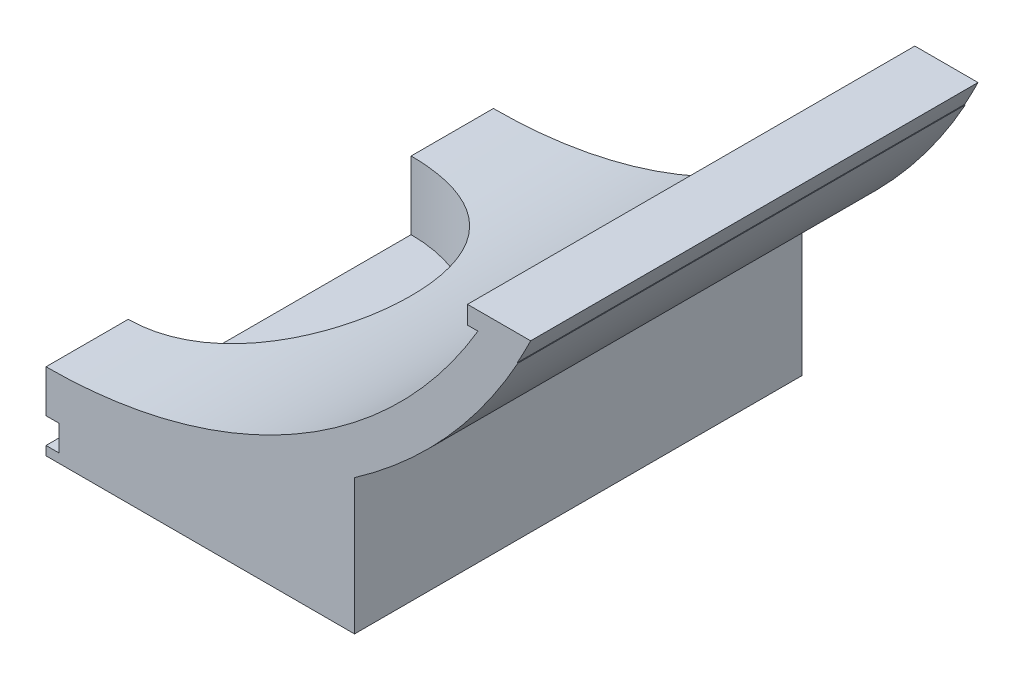
ISO-10303-21;
HEADER;
FILE_DESCRIPTION(('STEP AP214'),'2;1');
FILE_NAME('part.step','',(''),(''),'','','');
FILE_SCHEMA(('AUTOMOTIVE_DESIGN { 1 0 10303 214 1 1 1 1 }'));
ENDSEC;
DATA;
#1=APPLICATION_CONTEXT('core data for automotive mechanical design processes');
#2=APPLICATION_PROTOCOL_DEFINITION('international standard','automotive_design',2000,#1);
#3=PRODUCT_CONTEXT('',#1,'mechanical');
#4=PRODUCT('Part','Part','',(#3));
#5=PRODUCT_RELATED_PRODUCT_CATEGORY('part','',(#4));
#6=PRODUCT_DEFINITION_FORMATION('','',#4);
#7=PRODUCT_DEFINITION_CONTEXT('part definition',#1,'design');
#8=PRODUCT_DEFINITION('design','',#6,#7);
#9=PRODUCT_DEFINITION_SHAPE('','',#8);
#10=(LENGTH_UNIT() NAMED_UNIT(*) SI_UNIT(.MILLI.,.METRE.));
#11=(NAMED_UNIT(*) PLANE_ANGLE_UNIT() SI_UNIT($,.RADIAN.));
#12=(NAMED_UNIT(*) SI_UNIT($,.STERADIAN.) SOLID_ANGLE_UNIT());
#13=UNCERTAINTY_MEASURE_WITH_UNIT(LENGTH_MEASURE(1.E-05),#10,'distance_accuracy_value','');
#14=(GEOMETRIC_REPRESENTATION_CONTEXT(3) GLOBAL_UNCERTAINTY_ASSIGNED_CONTEXT((#13)) GLOBAL_UNIT_ASSIGNED_CONTEXT((#10,
#11,#12)) REPRESENTATION_CONTEXT('',''));
#15=CARTESIAN_POINT('',(0.,0.,0.));
#16=DIRECTION('',(0.,0.,1.));
#17=DIRECTION('',(1.,0.,0.));
#18=AXIS2_PLACEMENT_3D('',#15,#16,#17);
#19=CARTESIAN_POINT('',(0.,0.,174.));
#20=DIRECTION('',(0.,0.,1.));
#21=DIRECTION('',(1.,0.,0.));
#22=AXIS2_PLACEMENT_3D('',#19,#20,#21);
#23=PLANE('',#22);
#24=DIRECTION('',(0.,1.,0.));
#25=VECTOR('',#24,1.);
#26=CARTESIAN_POINT('',(0.,0.,174.));
#27=LINE('',#26,#25);
#28=CARTESIAN_POINT('',(0.,-225.,174.));
#29=VERTEX_POINT('',#28);
#30=CARTESIAN_POINT('',(0.,-221.5,174.));
#31=VERTEX_POINT('',#30);
#32=EDGE_CURVE('E58',#29,#31,#27,.T.);
#33=ORIENTED_EDGE('',*,*,#32,.F.);
#34=DIRECTION('',(1.,0.,0.));
#35=VECTOR('',#34,1.);
#36=CARTESIAN_POINT('',(0.,-225.,174.));
#37=LINE('',#36,#35);
#38=CARTESIAN_POINT('',(120.,-225.,174.));
#39=VERTEX_POINT('',#38);
#40=EDGE_CURVE('E185',#29,#39,#37,.T.);
#41=ORIENTED_EDGE('',*,*,#40,.T.);
#42=DIRECTION('',(0.,1.,0.));
#43=VECTOR('',#42,1.);
#44=CARTESIAN_POINT('',(120.,0.,174.));
#45=LINE('',#44,#43);
#46=CARTESIAN_POINT('',(120.,-172.336879396141,174.));
#47=VERTEX_POINT('',#46);
#48=EDGE_CURVE('E223',#39,#47,#45,.T.);
#49=ORIENTED_EDGE('',*,*,#48,.T.);
#50=CARTESIAN_POINT('',(0.,0.,174.));
#51=DIRECTION('',(0.,0.,1.));
#52=DIRECTION('',(1.,0.,0.));
#53=AXIS2_PLACEMENT_3D('',#50,#51,#52);
#54=CIRCLE('',#53,210.);
#55=CARTESIAN_POINT('',(183.56470248934,-102.,174.));
#56=VERTEX_POINT('',#55);
#57=EDGE_CURVE('E241',#47,#56,#54,.T.);
#58=ORIENTED_EDGE('',*,*,#57,.T.);
#59=DIRECTION('',(1.,0.,0.));
#60=VECTOR('',#59,1.);
#61=CARTESIAN_POINT('',(0.,-102.,174.));
#62=LINE('',#61,#60);
#63=CARTESIAN_POINT('',(183.278647146906,-102.,174.));
#64=VERTEX_POINT('',#63);
#65=EDGE_CURVE('E236',#64,#56,#62,.T.);
#66=ORIENTED_EDGE('',*,*,#65,.F.);
#67=CARTESIAN_POINT('',(0.,0.,174.));
#68=DIRECTION('',(0.,0.,1.));
#69=DIRECTION('',(1.,0.,0.));
#70=AXIS2_PLACEMENT_3D('',#67,#68,#69);
#71=CIRCLE('',#70,209.75);
#72=CARTESIAN_POINT('',(188.496850106308,-92.0000000000001,174.));
#73=VERTEX_POINT('',#72);
#74=EDGE_CURVE('E209',#64,#73,#71,.T.);
#75=ORIENTED_EDGE('',*,*,#74,.T.);
#76=DIRECTION('',(-1.,0.,0.));
#77=VECTOR('',#76,1.);
#78=CARTESIAN_POINT('',(171.933126534708,-92.,174.));
#79=LINE('',#78,#77);
#80=CARTESIAN_POINT('',(163.933126534708,-92.,174.));
#81=VERTEX_POINT('',#80);
#82=EDGE_CURVE('E217',#73,#81,#79,.T.);
#83=ORIENTED_EDGE('',*,*,#82,.T.);
#84=DIRECTION('',(0.,1.,0.));
#85=VECTOR('',#84,1.);
#86=CARTESIAN_POINT('',(163.933126534708,-92.,174.));
#87=LINE('',#86,#85);
#88=CARTESIAN_POINT('',(163.933126534708,-99.,174.));
#89=VERTEX_POINT('',#88);
#90=EDGE_CURVE('E199',#89,#81,#87,.T.);
#91=ORIENTED_EDGE('',*,*,#90,.F.);
#92=DIRECTION('',(-1.,0.,0.));
#93=VECTOR('',#92,1.);
#94=CARTESIAN_POINT('',(163.933126534708,-99.,174.));
#95=LINE('',#94,#93);
#96=CARTESIAN_POINT('',(168.,-99.,174.));
#97=VERTEX_POINT('',#96);
#98=EDGE_CURVE('E193',#97,#89,#95,.T.);
#99=ORIENTED_EDGE('',*,*,#98,.F.);
#100=CARTESIAN_POINT('',(0.,0.,174.));
#101=DIRECTION('',(0.,0.,-1.));
#102=DIRECTION('',(1.,0.,0.));
#103=AXIS2_PLACEMENT_3D('',#100,#101,#102);
#104=CIRCLE('',#103,195.);
#105=CARTESIAN_POINT('',(0.,-195.,174.));
#106=VERTEX_POINT('',#105);
#107=EDGE_CURVE('E159',#97,#106,#104,.T.);
#108=ORIENTED_EDGE('',*,*,#107,.T.);
#109=CARTESIAN_POINT('',(0.,-211.5,174.));
#110=VERTEX_POINT('',#109);
#111=EDGE_CURVE('E148',#110,#106,#27,.T.);
#112=ORIENTED_EDGE('',*,*,#111,.F.);
#113=DIRECTION('',(1.,0.,0.));
#114=VECTOR('',#113,1.);
#115=CARTESIAN_POINT('',(0.,-211.5,174.));
#116=LINE('',#115,#114);
#117=CARTESIAN_POINT('',(5.,-211.5,174.));
#118=VERTEX_POINT('',#117);
#119=EDGE_CURVE('E156',#110,#118,#116,.T.);
#120=ORIENTED_EDGE('',*,*,#119,.T.);
#121=DIRECTION('',(0.,-1.,0.));
#122=VECTOR('',#121,1.);
#123=CARTESIAN_POINT('',(5.00000000000002,0.,174.));
#124=LINE('',#123,#122);
#125=CARTESIAN_POINT('',(5.,-221.5,174.));
#126=VERTEX_POINT('',#125);
#127=EDGE_CURVE('E167',#118,#126,#124,.T.);
#128=ORIENTED_EDGE('',*,*,#127,.T.);
#129=DIRECTION('',(-1.,0.,0.));
#130=VECTOR('',#129,1.);
#131=CARTESIAN_POINT('',(0.,-221.5,174.));
#132=LINE('',#131,#130);
#133=EDGE_CURVE('E171',#126,#31,#132,.T.);
#134=ORIENTED_EDGE('',*,*,#133,.T.);
#135=EDGE_LOOP('',(#33,#41,#49,#58,#66,#75,#83,#91,#99,#108,#112,#120,#128,#134));
#136=FACE_BOUND('',#135,.T.);
#137=ADVANCED_FACE('F43',(#136),#23,.T.);
#138=CARTESIAN_POINT('',(0.,-221.5,87.));
#139=DIRECTION('',(0.,1.,0.));
#140=DIRECTION('',(0.,0.,1.));
#141=AXIS2_PLACEMENT_3D('',#138,#139,#140);
#142=CYLINDRICAL_SURFACE('',#141,55.);
#143=CARTESIAN_POINT('',(0.,-195.,142.));
#144=CARTESIAN_POINT('',(1.51277598464168,-194.999997304751,141.999995610297));
#145=CARTESIAN_POINT('',(3.02563306617673,-194.982353560653,141.93753465475));
#146=CARTESIAN_POINT('',(6.04030681610823,-194.912258782389,141.688232088754));
#147=CARTESIAN_POINT('',(7.54212268342941,-194.859805247374,141.501381541749));
#148=CARTESIAN_POINT('',(10.5242864998696,-194.721514711655,141.004861870919));
#149=CARTESIAN_POINT('',(12.0046267379808,-194.635666013523,140.69514971122));
#150=CARTESIAN_POINT('',(14.9327576670529,-194.432936319551,139.955576125098));
#151=CARTESIAN_POINT('',(16.3805488217454,-194.316055766129,139.525716411608));
#152=CARTESIAN_POINT('',(19.2316449690921,-194.054606947669,138.550081244053));
#153=CARTESIAN_POINT('',(20.6350093429244,-193.910077631711,138.004468735609));
#154=CARTESIAN_POINT('',(23.3900720949104,-193.597073533787,136.80124640194));
#155=CARTESIAN_POINT('',(24.7417703476622,-193.428598693706,136.143636304901));
#156=CARTESIAN_POINT('',(27.3849321959632,-193.072121722803,134.72125352611));
#157=CARTESIAN_POINT('',(28.6763923140339,-192.884118466645,133.956474667808));
#158=CARTESIAN_POINT('',(31.1910004963923,-192.493482436804,132.32513389038));
#159=CARTESIAN_POINT('',(32.4141473302252,-192.290849399763,131.458570138783));
#160=CARTESIAN_POINT('',(34.8121052649309,-191.871397239887,129.608255675445));
#161=CARTESIAN_POINT('',(35.985145512741,-191.654358471269,128.62225916456));
#162=CARTESIAN_POINT('',(38.2445264347831,-191.21631917666,126.556283582681));
#163=CARTESIAN_POINT('',(39.3308658605527,-190.995318593676,125.47630315882));
#164=CARTESIAN_POINT('',(41.4100573863605,-190.555337694959,123.229140506784));
#165=CARTESIAN_POINT('',(42.4028965244983,-190.336357663118,122.061946228299));
#166=CARTESIAN_POINT('',(44.2884084378103,-189.906482695444,119.647858408345));
#167=CARTESIAN_POINT('',(45.181080405655,-189.695587824785,118.400964224635));
#168=CARTESIAN_POINT('',(46.8765745407372,-189.283815921787,115.810239545886));
#169=CARTESIAN_POINT('',(47.6772977159791,-189.083215525293,114.464990030597));
#170=CARTESIAN_POINT('',(49.162230637943,-188.702577945346,111.708813244506));
#171=CARTESIAN_POINT('',(49.8464384655657,-188.522541100608,110.297884892409));
#172=CARTESIAN_POINT('',(51.0927350973465,-188.188599218257,107.42034060372));
#173=CARTESIAN_POINT('',(51.6548437850889,-188.034689926722,105.953733780017));
#174=CARTESIAN_POINT('',(52.6522576710364,-187.757844041035,102.97517381577));
#175=CARTESIAN_POINT('',(53.0875668143327,-187.634906483282,101.46322208765));
#176=CARTESIAN_POINT('',(53.8181863976163,-187.426635157743,98.4435623179981));
#177=CARTESIAN_POINT('',(54.1167289707947,-187.340437004747,96.936695711525));
#178=CARTESIAN_POINT('',(54.586856670881,-187.203993562236,93.9016672922743));
#179=CARTESIAN_POINT('',(54.75844373239,-187.153747724864,92.3735058043586));
#180=CARTESIAN_POINT('',(54.9730432374301,-187.090825739297,89.3076899008145));
#181=CARTESIAN_POINT('',(55.0160792915418,-187.078142692059,87.7700372803878));
#182=CARTESIAN_POINT('',(54.9732343190708,-187.09073748328,84.6967010099465));
#183=CARTESIAN_POINT('',(54.887355681379,-187.116014618306,83.1610173239737));
#184=CARTESIAN_POINT('',(54.5922403009783,-187.202323309921,80.1515882440086));
#185=CARTESIAN_POINT('',(54.3869816817835,-187.262201453032,78.6774175080696));
#186=CARTESIAN_POINT('',(53.8581194766046,-187.41499037387,75.7522458772274));
#187=CARTESIAN_POINT('',(53.5345187495676,-187.507900353601,74.3012444234769));
#188=CARTESIAN_POINT('',(52.7716565927596,-187.724024039912,71.4322191048295));
#189=CARTESIAN_POINT('',(52.3323881639886,-187.847239580238,70.0141972411653));
#190=CARTESIAN_POINT('',(51.3416985166608,-188.120423591712,67.2205508089576));
#191=CARTESIAN_POINT('',(50.7902750928457,-188.270392588895,65.8449270746838));
#192=CARTESIAN_POINT('',(49.5719407427942,-188.594869390542,63.1281257936024));
#193=CARTESIAN_POINT('',(48.9036859021021,-188.769657733188,61.7875846456117));
#194=CARTESIAN_POINT('',(47.4613520849324,-189.137446531583,59.1673453312611));
#195=CARTESIAN_POINT('',(46.6872726568405,-189.330447065053,57.8876474245857));
#196=CARTESIAN_POINT('',(45.0384344896766,-189.729435603099,55.3966655699284));
#197=CARTESIAN_POINT('',(44.1636575337009,-189.935425954569,54.1853940600432));
#198=CARTESIAN_POINT('',(42.3192039321344,-190.354877199058,51.838767050779));
#199=CARTESIAN_POINT('',(41.3495249884407,-190.568338272905,50.7034133909127));
#200=CARTESIAN_POINT('',(39.2840355631165,-191.005023396751,48.475253402716));
#201=CARTESIAN_POINT('',(38.1849013302693,-191.228318156092,47.3855395329822));
#202=CARTESIAN_POINT('',(35.8982517288536,-191.67073699137,45.3021832093801));
#203=CARTESIAN_POINT('',(34.7107341671541,-191.889860963646,44.3085431408805));
#204=CARTESIAN_POINT('',(32.2549075063342,-192.317899025981,42.4240354736116));
#205=CARTESIAN_POINT('',(30.9865936554316,-192.526812514263,41.5331739281184));
#206=CARTESIAN_POINT('',(28.3774891485624,-192.928639740406,39.8606401400473));
#207=CARTESIAN_POINT('',(27.0366989896612,-193.121553587973,39.0789671487516));
#208=CARTESIAN_POINT('',(24.2841503406643,-193.486995820346,37.626785886393));
#209=CARTESIAN_POINT('',(22.872049070732,-193.659409035535,36.9568978383738));
#210=CARTESIAN_POINT('',(19.9933641479954,-193.977736178376,35.7388260939951));
#211=CARTESIAN_POINT('',(18.5267800671251,-194.123649897772,35.1906433540984));
#212=CARTESIAN_POINT('',(15.5499999242052,-194.384745205353,34.2207670888056));
#213=CARTESIAN_POINT('',(14.0398126256082,-194.499932921909,33.7990483377956));
#214=CARTESIAN_POINT('',(10.9868456927494,-194.696246881347,33.0857502506882));
#215=CARTESIAN_POINT('',(9.44406710114175,-194.777374212154,32.7941667579131));
#216=CARTESIAN_POINT('',(6.38759737955367,-194.901161078377,32.3510633816287));
#217=CARTESIAN_POINT('',(4.87455911709058,-194.94497035096,32.1953533234206));
#218=CARTESIAN_POINT('',(1.84018665814559,-194.997220478891,32.0097825472414));
#219=CARTESIAN_POINT('',(0.318852639704865,-195.005662090324,31.9799191389463));
#220=CARTESIAN_POINT('',(-2.72067114375175,-194.986942029158,32.0463054967055));
#221=CARTESIAN_POINT('',(-4.23886122557451,-194.959784138108,32.1425418678469));
#222=CARTESIAN_POINT('',(-7.26103653739713,-194.870630723845,32.4602353545998));
#223=CARTESIAN_POINT('',(-8.765021849285,-194.808635401589,32.6816917478914));
#224=CARTESIAN_POINT('',(-11.7185674550566,-194.653074412565,33.2423005147627));
#225=CARTESIAN_POINT('',(-13.1686167043497,-194.560151370275,33.5790608624129));
#226=CARTESIAN_POINT('',(-16.0346101227006,-194.344941863136,34.3682562724752));
#227=CARTESIAN_POINT('',(-17.4505548668401,-194.222655893797,34.8206893828778));
#228=CARTESIAN_POINT('',(-20.239101414165,-193.951905110252,35.837693591339));
#229=CARTESIAN_POINT('',(-21.6116996780089,-193.803438164791,36.4022738191746));
#230=CARTESIAN_POINT('',(-24.3046889918928,-193.484162013078,37.6393085686977));
#231=CARTESIAN_POINT('',(-25.6250788776387,-193.313352308927,38.3117654944437));
#232=CARTESIAN_POINT('',(-28.2329132181185,-192.949922490515,39.7751609714886));
#233=CARTESIAN_POINT('',(-29.519061548626,-192.756916069748,40.5683133943173));
#234=CARTESIAN_POINT('',(-32.0203400821098,-192.35722551291,42.2565691287422));
#235=CARTESIAN_POINT('',(-33.235469482682,-192.150541222357,43.1516735919021));
#236=CARTESIAN_POINT('',(-35.5874725145358,-191.728870384718,45.0380551409026));
#237=CARTESIAN_POINT('',(-36.7243310563164,-191.513882249171,46.0293506827473));
#238=CARTESIAN_POINT('',(-38.9125867826961,-191.081278017958,48.1016524547747));
#239=CARTESIAN_POINT('',(-39.9639823382036,-190.863661872288,49.1826603942576));
#240=CARTESIAN_POINT('',(-42.0068287968446,-190.424663688709,51.4634820536823));
#241=CARTESIAN_POINT('',(-42.9953032651288,-190.203382512631,52.6659833901291));
#242=CARTESIAN_POINT('',(-44.8675674807035,-189.770453355497,55.151572228421));
#243=CARTESIAN_POINT('',(-45.7513547796848,-189.558805599808,56.4346616138977));
#244=CARTESIAN_POINT('',(-47.4079032742508,-189.151311295467,59.0730086424281));
#245=CARTESIAN_POINT('',(-48.1806657935975,-188.95546455843,60.4282654247568));
#246=CARTESIAN_POINT('',(-49.609306663953,-188.585422348909,63.2018895610344));
#247=CARTESIAN_POINT('',(-50.2651868880261,-188.41122652948,64.6202559031836));
#248=CARTESIAN_POINT('',(-51.4515194101969,-188.090714591469,67.5024025647285));
#249=CARTESIAN_POINT('',(-51.9826387878447,-187.944251048306,68.9658917148034));
#250=CARTESIAN_POINT('',(-52.9195244587185,-187.682606546131,71.935223920435));
#251=CARTESIAN_POINT('',(-53.32529079328,-187.567425576802,73.4410669620252));
#252=CARTESIAN_POINT('',(-54.0077324467009,-187.372065704206,76.4835904167211));
#253=CARTESIAN_POINT('',(-54.2844395155644,-187.291878192473,78.0202631482542));
#254=CARTESIAN_POINT('',(-54.706299470099,-187.169092825265,81.113035288433));
#255=CARTESIAN_POINT('',(-54.8514566322037,-187.126493747863,82.6691340639081));
#256=CARTESIAN_POINT('',(-55.0059350885892,-187.081140474726,85.7311540434134));
#257=CARTESIAN_POINT('',(-55.0200592029773,-187.07697748964,87.2368141228749));
#258=CARTESIAN_POINT('',(-54.9248583842064,-187.104950316674,90.2438606326164));
#259=CARTESIAN_POINT('',(-54.8155366395511,-187.137085191252,91.7452471722744));
#260=CARTESIAN_POINT('',(-54.474438998226,-187.236660182412,94.7327825235859));
#261=CARTESIAN_POINT('',(-54.242667739981,-187.304098961669,96.2189319102538));
#262=CARTESIAN_POINT('',(-53.6587131692459,-187.472223660234,99.1654548680127));
#263=CARTESIAN_POINT('',(-53.306529257297,-187.572909745057,100.625828310743));
#264=CARTESIAN_POINT('',(-52.4887374259627,-187.803383553097,103.496617769752));
#265=CARTESIAN_POINT('',(-52.0242661681516,-187.932878661644,104.907381560932));
#266=CARTESIAN_POINT('',(-50.9838485852516,-188.217793669274,107.684434863653));
#267=CARTESIAN_POINT('',(-50.4079034401043,-188.373213293946,109.050724845765));
#268=CARTESIAN_POINT('',(-49.1487429468255,-188.705656652546,111.730405540767));
#269=CARTESIAN_POINT('',(-48.4655133229456,-188.882683260896,113.043789184439));
#270=CARTESIAN_POINT('',(-46.9966216973714,-189.253510163334,115.609488643802));
#271=CARTESIAN_POINT('',(-46.2109569467775,-189.447310907518,116.861802819423));
#272=CARTESIAN_POINT('',(-44.5151536149936,-189.853062976584,119.337676095336));
#273=CARTESIAN_POINT('',(-43.6017904708369,-190.065400173821,120.558964323428));
#274=CARTESIAN_POINT('',(-41.6774853507142,-190.496612007318,122.920853720066));
#275=CARTESIAN_POINT('',(-40.66654134687,-190.715486779373,124.061453210924));
#276=CARTESIAN_POINT('',(-38.5533331692757,-191.153877639405,126.255068471827));
#277=CARTESIAN_POINT('',(-37.4510474753336,-191.373393866689,127.308063484396));
#278=CARTESIAN_POINT('',(-35.1622995871373,-191.807114286307,129.319424849606));
#279=CARTESIAN_POINT('',(-33.975836966903,-192.021318451751,130.277790723315));
#280=CARTESIAN_POINT('',(-31.4957016907239,-192.443866652879,132.116095107206));
#281=CARTESIAN_POINT('',(-30.2000984393956,-192.651933098431,132.993495252527));
#282=CARTESIAN_POINT('',(-27.5368111149729,-193.05060678832,134.63582320654));
#283=CARTESIAN_POINT('',(-26.169123975991,-193.241213289103,135.400746226079));
#284=CARTESIAN_POINT('',(-23.3717389221184,-193.599455338112,136.811793217101));
#285=CARTESIAN_POINT('',(-21.9420720610811,-193.76710221867,137.457975850282));
#286=CARTESIAN_POINT('',(-19.0302533374737,-194.074706450383,138.626638816058));
#287=CARTESIAN_POINT('',(-17.5481076720372,-194.21466705819,139.149133699094));
#288=CARTESIAN_POINT('',(-14.7498370514193,-194.445706299648,140.002612249688));
#289=CARTESIAN_POINT('',(-13.4390480304431,-194.540866112287,140.350078116561));
#290=CARTESIAN_POINT('',(-10.793930863323,-194.705537511506,140.947464884264));
#291=CARTESIAN_POINT('',(-9.45960527280495,-194.775051864951,141.197396308171));
#292=CARTESIAN_POINT('',(-6.77514063970241,-194.88689524458,141.597975951774));
#293=CARTESIAN_POINT('',(-5.42500326360649,-194.929227109878,141.748634540207));
#294=CARTESIAN_POINT('',(-2.71659953508749,-194.985781967651,141.949653066806));
#295=CARTESIAN_POINT('',(-1.35833245921605,-195.000002420084,142.000003941546));
#296=CARTESIAN_POINT('',(0.,-195.,142.));
#297=B_SPLINE_CURVE_WITH_KNOTS('',3,(#143,#144,#145,#146,#147,#148,#149,#150,#151,#152,#153,
#154,#155,#156,#157,#158,#159,#160,#161,#162,#163,#164,#165,#166,#167,#168,#169,#170,#171,#172,
#173,#174,#175,#176,#177,#178,#179,#180,#181,#182,#183,#184,#185,#186,#187,#188,#189,#190,#191,
#192,#193,#194,#195,#196,#197,#198,#199,#200,#201,#202,#203,#204,#205,#206,#207,#208,#209,#210,
#211,#212,#213,#214,#215,#216,#217,#218,#219,#220,#221,#222,#223,#224,#225,#226,#227,#228,#229,
#230,#231,#232,#233,#234,#235,#236,#237,#238,#239,#240,#241,#242,#243,#244,#245,#246,#247,#248,
#249,#250,#251,#252,#253,#254,#255,#256,#257,#258,#259,#260,#261,#262,#263,#264,#265,#266,#267,
#268,#269,#270,#271,#272,#273,#274,#275,#276,#277,#278,#279,#280,#281,#282,#283,#284,#285,#286,
#287,#288,#289,#290,#291,#292,#293,#294,#295,#296),.UNSPECIFIED.,.T.,.F.,(4,2,2,2,2,2,2,2,2,2,2,
2,2,2,2,2,2,2,2,2,2,2,2,2,2,2,2,2,2,2,2,2,2,2,2,2,2,2,2,2,2,2,2,2,2,2,2,2,2,2,2,2,2,2,2,2,2,2,2,
2,2,2,2,2,2,2,2,2,2,2,2,2,2,2,2,2,4),(0.,4.53708199552157,9.07448998504358,13.6134887398362,
18.1524227858136,22.6850092589732,27.2176067327461,31.7504655451402,36.2834059768057,
40.9211271113907,45.5589150155437,50.197344910504,54.835812187691,59.5650078593128,
64.2942814169713,69.0227842441797,73.7511399386241,78.3611174003492,82.9710246118645,
87.5800850833786,92.1890601464245,96.6525972976513,101.116026624422,105.579726093363,
110.043513338709,114.562504972605,119.081515892236,123.601345621908,128.121284828783,
132.80716953111,137.493170547082,142.179447410498,146.865692138025,151.577130512371,
156.28860591185,160.99914089314,165.709525403472,170.268916812972,174.828210752236,
179.387020421064,183.945803793097,188.415231042029,192.88458287313,197.35429869862,
201.824114146662,206.388902897175,210.953743212778,215.51946111419,220.085266026704,
224.796514789388,229.507873711867,234.219176455568,238.930403692821,243.615836081421,
248.301266924986,252.985544492066,257.669669776858,262.18139537959,266.693004450877,
271.204442633299,275.715903275666,280.183478519555,284.651006477133,289.119129408338,
293.587372268618,298.20138291234,302.815489462845,307.430686209123,312.04590631243,
316.775727940309,321.505750900575,326.233430752597,330.960554170728,335.034930030026,
339.108866179737,343.182376752053,347.256255374672),.UNSPECIFIED.);
#298=CARTESIAN_POINT('',(0.,-195.,142.));
#299=VERTEX_POINT('',#298);
#300=CARTESIAN_POINT('',(0.,-195.,32.));
#301=VERTEX_POINT('',#300);
#302=EDGE_CURVE('E181',#299,#301,#297,.T.);
#303=ORIENTED_EDGE('',*,*,#302,.T.);
#304=DIRECTION('',(0.,1.,0.));
#305=VECTOR('',#304,1.);
#306=CARTESIAN_POINT('',(0.,-221.5,32.));
#307=LINE('',#306,#305);
#308=CARTESIAN_POINT('',(0.,-221.5,32.));
#309=VERTEX_POINT('',#308);
#310=EDGE_CURVE('E316',#301,#309,#307,.F.);
#311=ORIENTED_EDGE('',*,*,#310,.T.);
#312=CARTESIAN_POINT('',(0.,-221.5,87.));
#313=DIRECTION('',(0.,1.,0.));
#314=DIRECTION('',(0.,0.,1.));
#315=AXIS2_PLACEMENT_3D('',#312,#313,#314);
#316=CIRCLE('',#315,55.);
#317=CARTESIAN_POINT('',(5.,-221.5,141.772255750517));
#318=VERTEX_POINT('',#317);
#319=EDGE_CURVE('E178',#318,#309,#316,.T.);
#320=ORIENTED_EDGE('',*,*,#319,.F.);
#321=DIRECTION('',(0.,1.,0.));
#322=VECTOR('',#321,1.);
#323=CARTESIAN_POINT('',(5.,-221.5,141.772255750517));
#324=LINE('',#323,#322);
#325=CARTESIAN_POINT('',(5.,-211.5,141.772255750517));
#326=VERTEX_POINT('',#325);
#327=EDGE_CURVE('E175',#326,#318,#324,.F.);
#328=ORIENTED_EDGE('',*,*,#327,.F.);
#329=CARTESIAN_POINT('',(0.,-211.5,87.));
#330=DIRECTION('',(0.,-1.,0.));
#331=DIRECTION('',(0.,0.,-1.));
#332=AXIS2_PLACEMENT_3D('',#329,#330,#331);
#333=CIRCLE('',#332,55.);
#334=CARTESIAN_POINT('',(0.,-211.5,142.));
#335=VERTEX_POINT('',#334);
#336=EDGE_CURVE('E51',#335,#326,#333,.F.);
#337=ORIENTED_EDGE('',*,*,#336,.F.);
#338=DIRECTION('',(0.,1.,0.));
#339=VECTOR('',#338,1.);
#340=CARTESIAN_POINT('',(0.,-221.5,142.));
#341=LINE('',#340,#339);
#342=EDGE_CURVE('E65',#335,#299,#341,.T.);
#343=ORIENTED_EDGE('',*,*,#342,.T.);
#344=EDGE_LOOP('',(#303,#311,#320,#328,#337,#343));
#345=FACE_BOUND('',#344,.T.);
#346=ADVANCED_FACE('F256',(#345),#142,.F.);
#347=CARTESIAN_POINT('',(0.,0.,174.));
#348=DIRECTION('',(0.,0.,-1.));
#349=DIRECTION('',(-1.,0.,0.));
#350=AXIS2_PLACEMENT_3D('',#347,#348,#349);
#351=CYLINDRICAL_SURFACE('',#350,210.);
#352=ORIENTED_EDGE('',*,*,#57,.F.);
#353=DIRECTION('',(0.,0.,1.));
#354=VECTOR('',#353,1.);
#355=CARTESIAN_POINT('',(120.,-172.336879396141,-115.957504903706));
#356=LINE('',#355,#354);
#357=CARTESIAN_POINT('',(120.,-172.336879396141,0.));
#358=VERTEX_POINT('',#357);
#359=EDGE_CURVE('E227',#358,#47,#356,.T.);
#360=ORIENTED_EDGE('',*,*,#359,.F.);
#361=CARTESIAN_POINT('',(0.,0.,0.));
#362=DIRECTION('',(0.,0.,1.));
#363=DIRECTION('',(1.,0.,0.));
#364=AXIS2_PLACEMENT_3D('',#361,#362,#363);
#365=CIRCLE('',#364,210.);
#366=CARTESIAN_POINT('',(183.56470248934,-102.,0.));
#367=VERTEX_POINT('',#366);
#368=EDGE_CURVE('E239',#358,#367,#365,.T.);
#369=ORIENTED_EDGE('',*,*,#368,.T.);
#370=DIRECTION('',(0.,0.,-1.));
#371=VECTOR('',#370,1.);
#372=CARTESIAN_POINT('',(183.56470248934,-102.,174.));
#373=LINE('',#372,#371);
#374=EDGE_CURVE('E233',#367,#56,#373,.F.);
#375=ORIENTED_EDGE('',*,*,#374,.T.);
#376=EDGE_LOOP('',(#352,#360,#369,#375));
#377=FACE_BOUND('',#376,.T.);
#378=ADVANCED_FACE('F45',(#377),#351,.T.);
#379=CARTESIAN_POINT('',(0.,0.,0.));
#380=DIRECTION('',(0.,0.,1.));
#381=DIRECTION('',(1.,0.,0.));
#382=AXIS2_PLACEMENT_3D('',#379,#380,#381);
#383=PLANE('',#382);
#384=DIRECTION('',(1.,0.,0.));
#385=VECTOR('',#384,1.);
#386=CARTESIAN_POINT('',(0.,-225.,0.));
#387=LINE('',#386,#385);
#388=CARTESIAN_POINT('',(0.,-225.,0.));
#389=VERTEX_POINT('',#388);
#390=CARTESIAN_POINT('',(120.,-225.,0.));
#391=VERTEX_POINT('',#390);
#392=EDGE_CURVE('E182',#389,#391,#387,.T.);
#393=ORIENTED_EDGE('',*,*,#392,.F.);
#394=DIRECTION('',(0.,1.,0.));
#395=VECTOR('',#394,1.);
#396=CARTESIAN_POINT('',(0.,0.,0.));
#397=LINE('',#396,#395);
#398=CARTESIAN_POINT('',(0.,-195.,0.));
#399=VERTEX_POINT('',#398);
#400=EDGE_CURVE('E306',#389,#399,#397,.T.);
#401=ORIENTED_EDGE('',*,*,#400,.T.);
#402=CARTESIAN_POINT('',(0.,0.,0.));
#403=DIRECTION('',(0.,0.,1.));
#404=DIRECTION('',(1.,0.,0.));
#405=AXIS2_PLACEMENT_3D('',#402,#403,#404);
#406=CIRCLE('',#405,195.);
#407=CARTESIAN_POINT('',(168.,-99.,0.));
#408=VERTEX_POINT('',#407);
#409=EDGE_CURVE('E221',#399,#408,#406,.T.);
#410=ORIENTED_EDGE('',*,*,#409,.T.);
#411=DIRECTION('',(-1.,0.,0.));
#412=VECTOR('',#411,1.);
#413=CARTESIAN_POINT('',(163.933126534708,-99.,0.));
#414=LINE('',#413,#412);
#415=CARTESIAN_POINT('',(163.933126534708,-99.,0.));
#416=VERTEX_POINT('',#415);
#417=EDGE_CURVE('E189',#408,#416,#414,.T.);
#418=ORIENTED_EDGE('',*,*,#417,.T.);
#419=DIRECTION('',(0.,1.,0.));
#420=VECTOR('',#419,1.);
#421=CARTESIAN_POINT('',(163.933126534708,-92.,0.));
#422=LINE('',#421,#420);
#423=CARTESIAN_POINT('',(163.933126534708,-92.,0.));
#424=VERTEX_POINT('',#423);
#425=EDGE_CURVE('E190',#416,#424,#422,.T.);
#426=ORIENTED_EDGE('',*,*,#425,.T.);
#427=DIRECTION('',(1.,0.,0.));
#428=VECTOR('',#427,1.);
#429=CARTESIAN_POINT('',(171.933126534708,-92.,0.));
#430=LINE('',#429,#428);
#431=CARTESIAN_POINT('',(188.496850106308,-92.0000000000001,0.));
#432=VERTEX_POINT('',#431);
#433=EDGE_CURVE('E213',#424,#432,#430,.T.);
#434=ORIENTED_EDGE('',*,*,#433,.T.);
#435=CARTESIAN_POINT('',(0.,0.,0.));
#436=DIRECTION('',(0.,0.,1.));
#437=DIRECTION('',(1.,0.,0.));
#438=AXIS2_PLACEMENT_3D('',#435,#436,#437);
#439=CIRCLE('',#438,209.75);
#440=CARTESIAN_POINT('',(183.278647146906,-102.,0.));
#441=VERTEX_POINT('',#440);
#442=EDGE_CURVE('E210',#432,#441,#439,.F.);
#443=ORIENTED_EDGE('',*,*,#442,.T.);
#444=DIRECTION('',(-1.,0.,0.));
#445=VECTOR('',#444,1.);
#446=CARTESIAN_POINT('',(0.,-102.,0.));
#447=LINE('',#446,#445);
#448=EDGE_CURVE('E237',#367,#441,#447,.T.);
#449=ORIENTED_EDGE('',*,*,#448,.F.);
#450=ORIENTED_EDGE('',*,*,#368,.F.);
#451=DIRECTION('',(0.,-1.,0.));
#452=VECTOR('',#451,1.);
#453=CARTESIAN_POINT('',(120.,0.,0.));
#454=LINE('',#453,#452);
#455=EDGE_CURVE('E230',#358,#391,#454,.T.);
#456=ORIENTED_EDGE('',*,*,#455,.T.);
#457=EDGE_LOOP('',(#393,#401,#410,#418,#426,#434,#443,#449,#450,#456));
#458=FACE_BOUND('',#457,.T.);
#459=ADVANCED_FACE('F293',(#458),#383,.F.);
#460=CARTESIAN_POINT('',(0.,-102.,-5.64183047049638));
#461=DIRECTION('',(0.,-1.,0.));
#462=DIRECTION('',(0.,0.,-1.));
#463=AXIS2_PLACEMENT_3D('',#460,#461,#462);
#464=PLANE('',#463);
#465=ORIENTED_EDGE('',*,*,#448,.T.);
#466=DIRECTION('',(0.,0.,1.));
#467=VECTOR('',#466,1.);
#468=CARTESIAN_POINT('',(183.278647146906,-102.,-394.954823365914));
#469=LINE('',#468,#467);
#470=EDGE_CURVE('E244',#441,#64,#469,.T.);
#471=ORIENTED_EDGE('',*,*,#470,.T.);
#472=ORIENTED_EDGE('',*,*,#65,.T.);
#473=ORIENTED_EDGE('',*,*,#374,.F.);
#474=EDGE_LOOP('',(#465,#471,#472,#473));
#475=FACE_BOUND('',#474,.T.);
#476=ADVANCED_FACE('F292',(#475),#464,.F.);
#477=CARTESIAN_POINT('',(120.,0.,-115.957504903706));
#478=DIRECTION('',(1.,0.,0.));
#479=DIRECTION('',(0.,0.,-1.));
#480=AXIS2_PLACEMENT_3D('',#477,#478,#479);
#481=PLANE('',#480);
#482=ORIENTED_EDGE('',*,*,#455,.F.);
#483=ORIENTED_EDGE('',*,*,#359,.T.);
#484=ORIENTED_EDGE('',*,*,#48,.F.);
#485=DIRECTION('',(0.,0.,1.));
#486=VECTOR('',#485,1.);
#487=CARTESIAN_POINT('',(120.,-225.,0.));
#488=LINE('',#487,#486);
#489=EDGE_CURVE('E184',#391,#39,#488,.T.);
#490=ORIENTED_EDGE('',*,*,#489,.F.);
#491=EDGE_LOOP('',(#482,#483,#484,#490));
#492=FACE_BOUND('',#491,.T.);
#493=ADVANCED_FACE('F300',(#492),#481,.T.);
#494=CARTESIAN_POINT('',(0.,0.,-365.268394471791));
#495=DIRECTION('',(0.,0.,1.));
#496=DIRECTION('',(1.,0.,0.));
#497=AXIS2_PLACEMENT_3D('',#494,#495,#496);
#498=CYLINDRICAL_SURFACE('',#497,195.);
#499=DIRECTION('',(0.,0.,1.));
#500=VECTOR('',#499,1.);
#501=CARTESIAN_POINT('',(0.,-195.,-365.268394471791));
#502=LINE('',#501,#500);
#503=EDGE_CURVE('E160',#106,#299,#502,.F.);
#504=ORIENTED_EDGE('',*,*,#503,.F.);
#505=ORIENTED_EDGE('',*,*,#107,.F.);
#506=DIRECTION('',(0.,0.,-1.));
#507=VECTOR('',#506,1.);
#508=CARTESIAN_POINT('',(168.,-99.,183.45827557051));
#509=LINE('',#508,#507);
#510=EDGE_CURVE('E205',#97,#408,#509,.T.);
#511=ORIENTED_EDGE('',*,*,#510,.T.);
#512=ORIENTED_EDGE('',*,*,#409,.F.);
#513=EDGE_CURVE('E313',#301,#399,#502,.F.);
#514=ORIENTED_EDGE('',*,*,#513,.F.);
#515=ORIENTED_EDGE('',*,*,#302,.F.);
#516=EDGE_LOOP('',(#504,#505,#511,#512,#514,#515));
#517=FACE_BOUND('',#516,.T.);
#518=ADVANCED_FACE('F252',(#517),#498,.F.);
#519=CARTESIAN_POINT('',(171.933126534708,-92.,-394.954823365914));
#520=DIRECTION('',(0.,1.,0.));
#521=DIRECTION('',(0.,0.,1.));
#522=AXIS2_PLACEMENT_3D('',#519,#520,#521);
#523=PLANE('',#522);
#524=ORIENTED_EDGE('',*,*,#433,.F.);
#525=DIRECTION('',(0.,0.,-1.));
#526=VECTOR('',#525,1.);
#527=CARTESIAN_POINT('',(163.933126534708,-92.,183.45827557051));
#528=LINE('',#527,#526);
#529=EDGE_CURVE('E202',#81,#424,#528,.T.);
#530=ORIENTED_EDGE('',*,*,#529,.F.);
#531=ORIENTED_EDGE('',*,*,#82,.F.);
#532=DIRECTION('',(0.,0.,1.));
#533=VECTOR('',#532,1.);
#534=CARTESIAN_POINT('',(188.496850106308,-92.0000000000001,-394.954823365914));
#535=LINE('',#534,#533);
#536=EDGE_CURVE('E214',#432,#73,#535,.T.);
#537=ORIENTED_EDGE('',*,*,#536,.F.);
#538=EDGE_LOOP('',(#524,#530,#531,#537));
#539=FACE_BOUND('',#538,.T.);
#540=ADVANCED_FACE('F277',(#539),#523,.T.);
#541=CARTESIAN_POINT('',(0.,0.,-394.954823365914));
#542=DIRECTION('',(0.,0.,1.));
#543=DIRECTION('',(1.,0.,0.));
#544=AXIS2_PLACEMENT_3D('',#541,#542,#543);
#545=CYLINDRICAL_SURFACE('',#544,209.75);
#546=ORIENTED_EDGE('',*,*,#470,.F.);
#547=ORIENTED_EDGE('',*,*,#442,.F.);
#548=ORIENTED_EDGE('',*,*,#536,.T.);
#549=ORIENTED_EDGE('',*,*,#74,.F.);
#550=EDGE_LOOP('',(#546,#547,#548,#549));
#551=FACE_BOUND('',#550,.T.);
#552=ADVANCED_FACE('F275',(#551),#545,.T.);
#553=CARTESIAN_POINT('',(163.933126534708,-99.,183.45827557051));
#554=DIRECTION('',(0.,-1.,0.));
#555=DIRECTION('',(1.,0.,0.));
#556=AXIS2_PLACEMENT_3D('',#553,#554,#555);
#557=PLANE('',#556);
#558=ORIENTED_EDGE('',*,*,#510,.F.);
#559=ORIENTED_EDGE('',*,*,#98,.T.);
#560=DIRECTION('',(0.,0.,-1.));
#561=VECTOR('',#560,1.);
#562=CARTESIAN_POINT('',(163.933126534708,-99.,183.45827557051));
#563=LINE('',#562,#561);
#564=EDGE_CURVE('E198',#89,#416,#563,.T.);
#565=ORIENTED_EDGE('',*,*,#564,.T.);
#566=ORIENTED_EDGE('',*,*,#417,.F.);
#567=EDGE_LOOP('',(#558,#559,#565,#566));
#568=FACE_BOUND('',#567,.T.);
#569=ADVANCED_FACE('F271',(#568),#557,.T.);
#570=CARTESIAN_POINT('',(163.933126534708,-92.,183.45827557051));
#571=DIRECTION('',(-1.,0.,0.));
#572=DIRECTION('',(0.,0.,1.));
#573=AXIS2_PLACEMENT_3D('',#570,#571,#572);
#574=PLANE('',#573);
#575=ORIENTED_EDGE('',*,*,#564,.F.);
#576=ORIENTED_EDGE('',*,*,#90,.T.);
#577=ORIENTED_EDGE('',*,*,#529,.T.);
#578=ORIENTED_EDGE('',*,*,#425,.F.);
#579=EDGE_LOOP('',(#575,#576,#577,#578));
#580=FACE_BOUND('',#579,.T.);
#581=ADVANCED_FACE('F267',(#580),#574,.T.);
#582=CARTESIAN_POINT('',(0.,-225.,0.));
#583=DIRECTION('',(0.,-1.,0.));
#584=DIRECTION('',(0.,0.,-1.));
#585=AXIS2_PLACEMENT_3D('',#582,#583,#584);
#586=PLANE('',#585);
#587=DIRECTION('',(0.,0.,1.));
#588=VECTOR('',#587,1.);
#589=CARTESIAN_POINT('',(0.,-225.,0.));
#590=LINE('',#589,#588);
#591=EDGE_CURVE('E312',#389,#29,#590,.T.);
#592=ORIENTED_EDGE('',*,*,#591,.F.);
#593=ORIENTED_EDGE('',*,*,#392,.T.);
#594=ORIENTED_EDGE('',*,*,#489,.T.);
#595=ORIENTED_EDGE('',*,*,#40,.F.);
#596=EDGE_LOOP('',(#592,#593,#594,#595));
#597=FACE_BOUND('',#596,.T.);
#598=ADVANCED_FACE('F264',(#597),#586,.T.);
#599=CARTESIAN_POINT('',(0.,-221.5,0.));
#600=DIRECTION('',(0.,1.,0.));
#601=DIRECTION('',(0.,0.,1.));
#602=AXIS2_PLACEMENT_3D('',#599,#600,#601);
#603=PLANE('',#602);
#604=DIRECTION('',(0.,0.,-1.));
#605=VECTOR('',#604,1.);
#606=CARTESIAN_POINT('',(0.,-221.5,0.));
#607=LINE('',#606,#605);
#608=EDGE_CURVE('E324',#31,#309,#607,.T.);
#609=ORIENTED_EDGE('',*,*,#608,.F.);
#610=ORIENTED_EDGE('',*,*,#133,.F.);
#611=DIRECTION('',(0.,0.,1.));
#612=VECTOR('',#611,1.);
#613=CARTESIAN_POINT('',(5.,-221.5,87.));
#614=LINE('',#613,#612);
#615=EDGE_CURVE('E166',#318,#126,#614,.T.);
#616=ORIENTED_EDGE('',*,*,#615,.F.);
#617=ORIENTED_EDGE('',*,*,#319,.T.);
#618=EDGE_LOOP('',(#609,#610,#616,#617));
#619=FACE_BOUND('',#618,.T.);
#620=ADVANCED_FACE('F262',(#619),#603,.T.);
#621=CARTESIAN_POINT('',(0.,-211.5,87.));
#622=DIRECTION('',(0.,-1.,0.));
#623=DIRECTION('',(0.,0.,-1.));
#624=AXIS2_PLACEMENT_3D('',#621,#622,#623);
#625=PLANE('',#624);
#626=DIRECTION('',(0.,0.,1.));
#627=VECTOR('',#626,1.);
#628=CARTESIAN_POINT('',(0.,-211.5,87.));
#629=LINE('',#628,#627);
#630=EDGE_CURVE('E12',#335,#110,#629,.T.);
#631=ORIENTED_EDGE('',*,*,#630,.F.);
#632=ORIENTED_EDGE('',*,*,#336,.T.);
#633=DIRECTION('',(0.,0.,1.));
#634=VECTOR('',#633,1.);
#635=CARTESIAN_POINT('',(5.,-211.5,87.));
#636=LINE('',#635,#634);
#637=EDGE_CURVE('E164',#326,#118,#636,.T.);
#638=ORIENTED_EDGE('',*,*,#637,.T.);
#639=ORIENTED_EDGE('',*,*,#119,.F.);
#640=EDGE_LOOP('',(#631,#632,#638,#639));
#641=FACE_BOUND('',#640,.T.);
#642=ADVANCED_FACE('F162',(#641),#625,.T.);
#643=CARTESIAN_POINT('',(5.00000000000002,0.,87.));
#644=DIRECTION('',(-1.,0.,0.));
#645=DIRECTION('',(0.,-1.,0.));
#646=AXIS2_PLACEMENT_3D('',#643,#644,#645);
#647=PLANE('',#646);
#648=ORIENTED_EDGE('',*,*,#327,.T.);
#649=ORIENTED_EDGE('',*,*,#615,.T.);
#650=ORIENTED_EDGE('',*,*,#127,.F.);
#651=ORIENTED_EDGE('',*,*,#637,.F.);
#652=EDGE_LOOP('',(#648,#649,#650,#651));
#653=FACE_BOUND('',#652,.T.);
#654=ADVANCED_FACE('F326',(#653),#647,.T.);
#655=CARTESIAN_POINT('',(0.,0.,0.));
#656=DIRECTION('',(1.,0.,0.));
#657=DIRECTION('',(0.,0.,-1.));
#658=AXIS2_PLACEMENT_3D('',#655,#656,#657);
#659=PLANE('',#658);
#660=ORIENTED_EDGE('',*,*,#503,.T.);
#661=ORIENTED_EDGE('',*,*,#342,.F.);
#662=ORIENTED_EDGE('',*,*,#630,.T.);
#663=ORIENTED_EDGE('',*,*,#111,.T.);
#664=EDGE_LOOP('',(#660,#661,#662,#663));
#665=FACE_BOUND('',#664,.T.);
#666=ADVANCED_FACE('F147',(#665),#659,.F.);
#667=ORIENTED_EDGE('',*,*,#591,.T.);
#668=ORIENTED_EDGE('',*,*,#32,.T.);
#669=ORIENTED_EDGE('',*,*,#608,.T.);
#670=ORIENTED_EDGE('',*,*,#310,.F.);
#671=ORIENTED_EDGE('',*,*,#513,.T.);
#672=ORIENTED_EDGE('',*,*,#400,.F.);
#673=EDGE_LOOP('',(#667,#668,#669,#670,#671,#672));
#674=FACE_BOUND('',#673,.T.);
#675=ADVANCED_FACE('F333',(#674),#659,.F.);
#676=CLOSED_SHELL('',(#137,#346,#378,#459,#476,#493,#518,#540,#552,#569,#581,#598,#620,#642,
#654,#666,#675));
#677=MANIFOLD_SOLID_BREP('B2',#676);
#678=ADVANCED_BREP_SHAPE_REPRESENTATION('',(#18,#677),#14);
#679=SHAPE_DEFINITION_REPRESENTATION(#9,#678);
ENDSEC;
END-ISO-10303-21;
